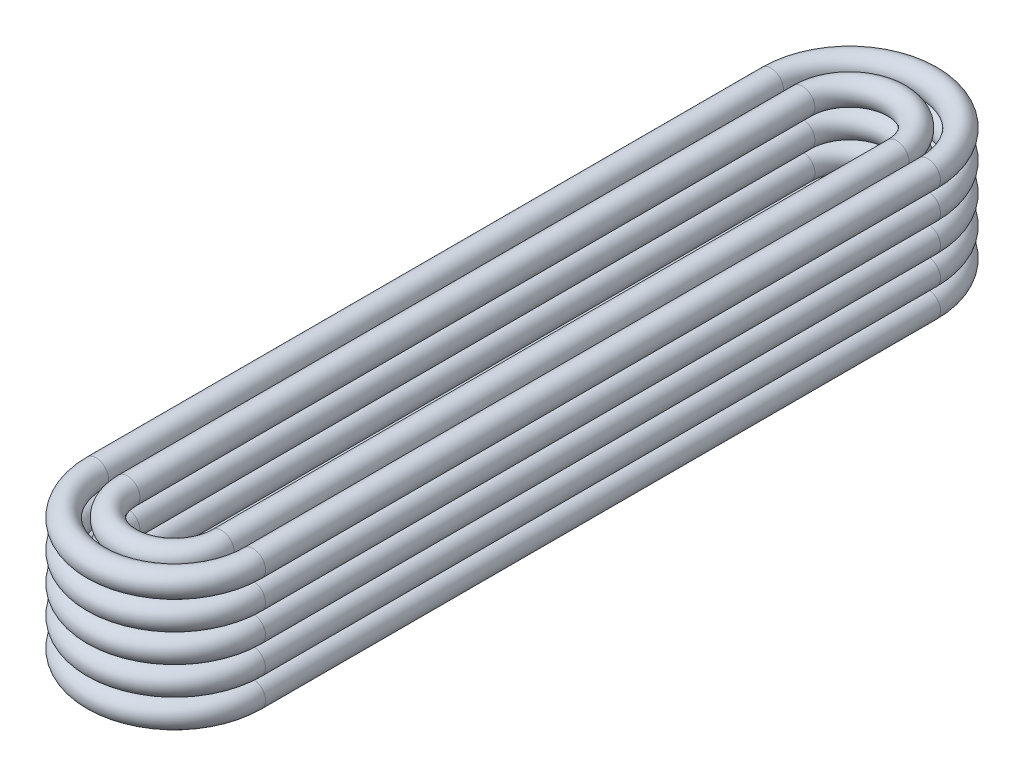
ISO-10303-21;
HEADER;
FILE_DESCRIPTION(('STEP AP214'),'2;1');
FILE_NAME('part.step','',(''),(''),'','','');
FILE_SCHEMA(('AUTOMOTIVE_DESIGN { 1 0 10303 214 1 1 1 1 }'));
ENDSEC;
DATA;
#1=APPLICATION_CONTEXT('core data for automotive mechanical design processes');
#2=APPLICATION_PROTOCOL_DEFINITION('international standard','automotive_design',2000,#1);
#3=PRODUCT_CONTEXT('',#1,'mechanical');
#4=PRODUCT('Part','Part','',(#3));
#5=PRODUCT_RELATED_PRODUCT_CATEGORY('part','',(#4));
#6=PRODUCT_DEFINITION_FORMATION('','',#4);
#7=PRODUCT_DEFINITION_CONTEXT('part definition',#1,'design');
#8=PRODUCT_DEFINITION('design','',#6,#7);
#9=PRODUCT_DEFINITION_SHAPE('','',#8);
#10=(LENGTH_UNIT() NAMED_UNIT(*) SI_UNIT(.MILLI.,.METRE.));
#11=(NAMED_UNIT(*) PLANE_ANGLE_UNIT() SI_UNIT($,.RADIAN.));
#12=(NAMED_UNIT(*) SI_UNIT($,.STERADIAN.) SOLID_ANGLE_UNIT());
#13=UNCERTAINTY_MEASURE_WITH_UNIT(LENGTH_MEASURE(1.E-05),#10,'distance_accuracy_value','');
#14=(GEOMETRIC_REPRESENTATION_CONTEXT(3) GLOBAL_UNCERTAINTY_ASSIGNED_CONTEXT((#13)) GLOBAL_UNIT_ASSIGNED_CONTEXT((#10,
#11,#12)) REPRESENTATION_CONTEXT('',''));
#15=CARTESIAN_POINT('',(0.,0.,0.));
#16=DIRECTION('',(0.,0.,1.));
#17=DIRECTION('',(1.,0.,0.));
#18=AXIS2_PLACEMENT_3D('',#15,#16,#17);
#19=CARTESIAN_POINT('',(0.,7.2,21.5));
#20=DIRECTION('',(0.,-1.,0.));
#21=DIRECTION('',(0.,0.,-1.));
#22=AXIS2_PLACEMENT_3D('',#19,#20,#21);
#23=TOROIDAL_SURFACE('',#22,5.,0.800000000000001);
#24=CARTESIAN_POINT('',(4.99999999999999,7.2,21.5));
#25=DIRECTION('',(0.,0.,-1.));
#26=DIRECTION('',(-1.,0.,0.));
#27=AXIS2_PLACEMENT_3D('',#24,#25,#26);
#28=CIRCLE('',#27,0.800000000000001);
#29=CARTESIAN_POINT('',(5.8,7.2,21.5));
#30=VERTEX_POINT('',#29);
#31=EDGE_CURVE('E46',#30,#30,#28,.T.);
#32=CARTESIAN_POINT('',(-5.,7.2,21.5));
#33=DIRECTION('',(0.,0.,1.));
#34=DIRECTION('',(1.,0.,0.));
#35=AXIS2_PLACEMENT_3D('',#32,#33,#34);
#36=CIRCLE('',#35,0.800000000000001);
#37=CARTESIAN_POINT('',(-5.8,7.2,21.5));
#38=VERTEX_POINT('',#37);
#39=EDGE_CURVE('E11',#38,#38,#36,.T.);
#40=CARTESIAN_POINT('',(0.,7.2,21.5));
#41=DIRECTION('',(0.,-1.,0.));
#42=DIRECTION('',(0.,0.,-1.));
#43=AXIS2_PLACEMENT_3D('',#40,#41,#42);
#44=CIRCLE('',#43,5.8);
#45=EDGE_CURVE('',#30,#38,#44,.T.);
#46=ORIENTED_EDGE('',*,*,#31,.F.);
#47=ORIENTED_EDGE('',*,*,#39,.T.);
#48=ORIENTED_EDGE('',*,*,#45,.T.);
#49=ORIENTED_EDGE('',*,*,#45,.F.);
#50=EDGE_LOOP('',(#46,#48,#47,#49));
#51=FACE_BOUND('',#50,.T.);
#52=ADVANCED_FACE('F40',(#51),#23,.T.);
#53=CARTESIAN_POINT('',(5.,7.2,-21.5));
#54=DIRECTION('',(0.,0.,1.));
#55=DIRECTION('',(1.,0.,0.));
#56=AXIS2_PLACEMENT_3D('',#53,#54,#55);
#57=CYLINDRICAL_SURFACE('',#56,0.800000000000001);
#58=CARTESIAN_POINT('',(5.,7.2,-21.5));
#59=DIRECTION('',(0.,0.,-1.));
#60=DIRECTION('',(-1.,0.,0.));
#61=AXIS2_PLACEMENT_3D('',#58,#59,#60);
#62=CIRCLE('',#61,0.800000000000001);
#63=CARTESIAN_POINT('',(5.8,7.2,-21.5));
#64=VERTEX_POINT('',#63);
#65=EDGE_CURVE('E50',#64,#64,#62,.T.);
#66=ORIENTED_EDGE('',*,*,#65,.F.);
#67=EDGE_LOOP('',(#66));
#68=FACE_BOUND('',#67,.T.);
#69=ORIENTED_EDGE('',*,*,#31,.T.);
#70=EDGE_LOOP('',(#69));
#71=FACE_BOUND('',#70,.T.);
#72=ADVANCED_FACE('F66',(#68,#71),#57,.T.);
#73=CARTESIAN_POINT('',(0.,7.2,-21.5));
#74=DIRECTION('',(0.,-1.,0.));
#75=DIRECTION('',(0.,0.,-1.));
#76=AXIS2_PLACEMENT_3D('',#73,#74,#75);
#77=TOROIDAL_SURFACE('',#76,5.,0.800000000000001);
#78=CARTESIAN_POINT('',(-5.00000000000001,7.2,-21.5));
#79=DIRECTION('',(0.,0.,1.));
#80=DIRECTION('',(1.,0.,0.));
#81=AXIS2_PLACEMENT_3D('',#78,#79,#80);
#82=CIRCLE('',#81,0.800000000000001);
#83=CARTESIAN_POINT('',(-5.80000000000001,7.2,-21.5));
#84=VERTEX_POINT('',#83);
#85=EDGE_CURVE('E54',#84,#84,#82,.T.);
#86=CARTESIAN_POINT('',(0.,7.2,-21.5));
#87=DIRECTION('',(0.,-1.,0.));
#88=DIRECTION('',(0.,0.,-1.));
#89=AXIS2_PLACEMENT_3D('',#86,#87,#88);
#90=CIRCLE('',#89,5.8);
#91=EDGE_CURVE('',#84,#64,#90,.T.);
#92=ORIENTED_EDGE('',*,*,#85,.F.);
#93=ORIENTED_EDGE('',*,*,#65,.T.);
#94=ORIENTED_EDGE('',*,*,#91,.T.);
#95=ORIENTED_EDGE('',*,*,#91,.F.);
#96=EDGE_LOOP('',(#92,#94,#93,#95));
#97=FACE_BOUND('',#96,.T.);
#98=ADVANCED_FACE('F63',(#97),#77,.T.);
#99=CARTESIAN_POINT('',(-5.00000000000001,7.2,-21.5));
#100=DIRECTION('',(0.,0.,1.));
#101=DIRECTION('',(1.,0.,0.));
#102=AXIS2_PLACEMENT_3D('',#99,#100,#101);
#103=CYLINDRICAL_SURFACE('',#102,0.800000000000001);
#104=ORIENTED_EDGE('',*,*,#85,.T.);
#105=EDGE_LOOP('',(#104));
#106=FACE_BOUND('',#105,.T.);
#107=ORIENTED_EDGE('',*,*,#39,.F.);
#108=EDGE_LOOP('',(#107));
#109=FACE_BOUND('',#108,.T.);
#110=ADVANCED_FACE('F60',(#106,#109),#103,.T.);
#111=CLOSED_SHELL('',(#52,#72,#98,#110));
#112=MANIFOLD_SOLID_BREP('B2',#111);
#113=CARTESIAN_POINT('',(0.,5.4,21.5));
#114=DIRECTION('',(0.,-1.,0.));
#115=DIRECTION('',(0.,0.,-1.));
#116=AXIS2_PLACEMENT_3D('',#113,#114,#115);
#117=TOROIDAL_SURFACE('',#116,5.,0.800000000000001);
#118=CARTESIAN_POINT('',(5.,5.4,21.5));
#119=DIRECTION('',(0.,0.,-1.));
#120=DIRECTION('',(-1.,0.,0.));
#121=AXIS2_PLACEMENT_3D('',#118,#119,#120);
#122=CIRCLE('',#121,0.800000000000001);
#123=CARTESIAN_POINT('',(5.8,5.4,21.5));
#124=VERTEX_POINT('',#123);
#125=EDGE_CURVE('E119',#124,#124,#122,.T.);
#126=CARTESIAN_POINT('',(-5.,5.4,21.5));
#127=DIRECTION('',(0.,0.,1.));
#128=DIRECTION('',(1.,0.,0.));
#129=AXIS2_PLACEMENT_3D('',#126,#127,#128);
#130=CIRCLE('',#129,0.800000000000001);
#131=CARTESIAN_POINT('',(-5.8,5.4,21.5));
#132=VERTEX_POINT('',#131);
#133=EDGE_CURVE('E39',#132,#132,#130,.T.);
#134=CARTESIAN_POINT('',(0.,5.4,21.5));
#135=DIRECTION('',(0.,-1.,0.));
#136=DIRECTION('',(0.,0.,-1.));
#137=AXIS2_PLACEMENT_3D('',#134,#135,#136);
#138=CIRCLE('',#137,5.8);
#139=EDGE_CURVE('',#124,#132,#138,.T.);
#140=ORIENTED_EDGE('',*,*,#125,.F.);
#141=ORIENTED_EDGE('',*,*,#133,.T.);
#142=ORIENTED_EDGE('',*,*,#139,.T.);
#143=ORIENTED_EDGE('',*,*,#139,.F.);
#144=EDGE_LOOP('',(#140,#142,#141,#143));
#145=FACE_BOUND('',#144,.T.);
#146=ADVANCED_FACE('F113',(#145),#117,.T.);
#147=CARTESIAN_POINT('',(5.,5.4,-21.5));
#148=DIRECTION('',(0.,0.,1.));
#149=DIRECTION('',(1.,0.,0.));
#150=AXIS2_PLACEMENT_3D('',#147,#148,#149);
#151=CYLINDRICAL_SURFACE('',#150,0.800000000000001);
#152=CARTESIAN_POINT('',(5.,5.4,-21.5));
#153=DIRECTION('',(0.,0.,-1.));
#154=DIRECTION('',(-1.,0.,0.));
#155=AXIS2_PLACEMENT_3D('',#152,#153,#154);
#156=CIRCLE('',#155,0.800000000000001);
#157=CARTESIAN_POINT('',(5.8,5.4,-21.5));
#158=VERTEX_POINT('',#157);
#159=EDGE_CURVE('E123',#158,#158,#156,.T.);
#160=ORIENTED_EDGE('',*,*,#159,.F.);
#161=EDGE_LOOP('',(#160));
#162=FACE_BOUND('',#161,.T.);
#163=ORIENTED_EDGE('',*,*,#125,.T.);
#164=EDGE_LOOP('',(#163));
#165=FACE_BOUND('',#164,.T.);
#166=ADVANCED_FACE('F139',(#162,#165),#151,.T.);
#167=CARTESIAN_POINT('',(0.,5.4,-21.5));
#168=DIRECTION('',(0.,-1.,0.));
#169=DIRECTION('',(0.,0.,-1.));
#170=AXIS2_PLACEMENT_3D('',#167,#168,#169);
#171=TOROIDAL_SURFACE('',#170,5.,0.800000000000001);
#172=CARTESIAN_POINT('',(-5.,5.4,-21.5));
#173=DIRECTION('',(0.,0.,1.));
#174=DIRECTION('',(1.,0.,0.));
#175=AXIS2_PLACEMENT_3D('',#172,#173,#174);
#176=CIRCLE('',#175,0.800000000000001);
#177=CARTESIAN_POINT('',(-5.80000000000001,5.4,-21.5));
#178=VERTEX_POINT('',#177);
#179=EDGE_CURVE('E127',#178,#178,#176,.T.);
#180=CARTESIAN_POINT('',(0.,5.4,-21.5));
#181=DIRECTION('',(0.,-1.,0.));
#182=DIRECTION('',(0.,0.,-1.));
#183=AXIS2_PLACEMENT_3D('',#180,#181,#182);
#184=CIRCLE('',#183,5.8);
#185=EDGE_CURVE('',#178,#158,#184,.T.);
#186=ORIENTED_EDGE('',*,*,#179,.F.);
#187=ORIENTED_EDGE('',*,*,#159,.T.);
#188=ORIENTED_EDGE('',*,*,#185,.T.);
#189=ORIENTED_EDGE('',*,*,#185,.F.);
#190=EDGE_LOOP('',(#186,#188,#187,#189));
#191=FACE_BOUND('',#190,.T.);
#192=ADVANCED_FACE('F136',(#191),#171,.T.);
#193=CARTESIAN_POINT('',(-5.,5.4,-21.5));
#194=DIRECTION('',(0.,0.,1.));
#195=DIRECTION('',(1.,0.,0.));
#196=AXIS2_PLACEMENT_3D('',#193,#194,#195);
#197=CYLINDRICAL_SURFACE('',#196,0.800000000000001);
#198=ORIENTED_EDGE('',*,*,#179,.T.);
#199=EDGE_LOOP('',(#198));
#200=FACE_BOUND('',#199,.T.);
#201=ORIENTED_EDGE('',*,*,#133,.F.);
#202=EDGE_LOOP('',(#201));
#203=FACE_BOUND('',#202,.T.);
#204=ADVANCED_FACE('F133',(#200,#203),#197,.T.);
#205=CLOSED_SHELL('',(#146,#166,#192,#204));
#206=MANIFOLD_SOLID_BREP('B6',#205);
#207=CARTESIAN_POINT('',(0.,3.6,21.5));
#208=DIRECTION('',(0.,-1.,0.));
#209=DIRECTION('',(0.,0.,-1.));
#210=AXIS2_PLACEMENT_3D('',#207,#208,#209);
#211=TOROIDAL_SURFACE('',#210,5.,0.800000000000001);
#212=CARTESIAN_POINT('',(5.,3.6,21.5));
#213=DIRECTION('',(0.,0.,-1.));
#214=DIRECTION('',(-1.,0.,0.));
#215=AXIS2_PLACEMENT_3D('',#212,#213,#214);
#216=CIRCLE('',#215,0.800000000000001);
#217=CARTESIAN_POINT('',(5.8,3.6,21.5));
#218=VERTEX_POINT('',#217);
#219=EDGE_CURVE('E192',#218,#218,#216,.T.);
#220=CARTESIAN_POINT('',(-5.,3.6,21.5));
#221=DIRECTION('',(0.,0.,1.));
#222=DIRECTION('',(1.,0.,0.));
#223=AXIS2_PLACEMENT_3D('',#220,#221,#222);
#224=CIRCLE('',#223,0.800000000000001);
#225=CARTESIAN_POINT('',(-5.8,3.6,21.5));
#226=VERTEX_POINT('',#225);
#227=EDGE_CURVE('E112',#226,#226,#224,.T.);
#228=CARTESIAN_POINT('',(0.,3.6,21.5));
#229=DIRECTION('',(0.,-1.,0.));
#230=DIRECTION('',(0.,0.,-1.));
#231=AXIS2_PLACEMENT_3D('',#228,#229,#230);
#232=CIRCLE('',#231,5.8);
#233=EDGE_CURVE('',#218,#226,#232,.T.);
#234=ORIENTED_EDGE('',*,*,#219,.F.);
#235=ORIENTED_EDGE('',*,*,#227,.T.);
#236=ORIENTED_EDGE('',*,*,#233,.T.);
#237=ORIENTED_EDGE('',*,*,#233,.F.);
#238=EDGE_LOOP('',(#234,#236,#235,#237));
#239=FACE_BOUND('',#238,.T.);
#240=ADVANCED_FACE('F186',(#239),#211,.T.);
#241=CARTESIAN_POINT('',(5.,3.6,-21.5));
#242=DIRECTION('',(0.,0.,1.));
#243=DIRECTION('',(1.,0.,0.));
#244=AXIS2_PLACEMENT_3D('',#241,#242,#243);
#245=CYLINDRICAL_SURFACE('',#244,0.800000000000001);
#246=CARTESIAN_POINT('',(5.,3.6,-21.5));
#247=DIRECTION('',(0.,0.,-1.));
#248=DIRECTION('',(-1.,0.,0.));
#249=AXIS2_PLACEMENT_3D('',#246,#247,#248);
#250=CIRCLE('',#249,0.800000000000001);
#251=CARTESIAN_POINT('',(5.80000000000001,3.6,-21.5));
#252=VERTEX_POINT('',#251);
#253=EDGE_CURVE('E196',#252,#252,#250,.T.);
#254=ORIENTED_EDGE('',*,*,#253,.F.);
#255=EDGE_LOOP('',(#254));
#256=FACE_BOUND('',#255,.T.);
#257=ORIENTED_EDGE('',*,*,#219,.T.);
#258=EDGE_LOOP('',(#257));
#259=FACE_BOUND('',#258,.T.);
#260=ADVANCED_FACE('F212',(#256,#259),#245,.T.);
#261=CARTESIAN_POINT('',(0.,3.6,-21.5));
#262=DIRECTION('',(0.,-1.,0.));
#263=DIRECTION('',(0.,0.,-1.));
#264=AXIS2_PLACEMENT_3D('',#261,#262,#263);
#265=TOROIDAL_SURFACE('',#264,5.,0.800000000000001);
#266=CARTESIAN_POINT('',(-5.,3.6,-21.5));
#267=DIRECTION('',(0.,0.,1.));
#268=DIRECTION('',(1.,0.,0.));
#269=AXIS2_PLACEMENT_3D('',#266,#267,#268);
#270=CIRCLE('',#269,0.800000000000001);
#271=CARTESIAN_POINT('',(-5.8,3.6,-21.5));
#272=VERTEX_POINT('',#271);
#273=EDGE_CURVE('E200',#272,#272,#270,.T.);
#274=CARTESIAN_POINT('',(0.,3.6,-21.5));
#275=DIRECTION('',(0.,-1.,0.));
#276=DIRECTION('',(0.,0.,-1.));
#277=AXIS2_PLACEMENT_3D('',#274,#275,#276);
#278=CIRCLE('',#277,5.8);
#279=EDGE_CURVE('',#272,#252,#278,.T.);
#280=ORIENTED_EDGE('',*,*,#273,.F.);
#281=ORIENTED_EDGE('',*,*,#253,.T.);
#282=ORIENTED_EDGE('',*,*,#279,.T.);
#283=ORIENTED_EDGE('',*,*,#279,.F.);
#284=EDGE_LOOP('',(#280,#282,#281,#283));
#285=FACE_BOUND('',#284,.T.);
#286=ADVANCED_FACE('F209',(#285),#265,.T.);
#287=CARTESIAN_POINT('',(-5.,3.6,-21.5));
#288=DIRECTION('',(0.,0.,1.));
#289=DIRECTION('',(1.,0.,0.));
#290=AXIS2_PLACEMENT_3D('',#287,#288,#289);
#291=CYLINDRICAL_SURFACE('',#290,0.800000000000001);
#292=ORIENTED_EDGE('',*,*,#273,.T.);
#293=EDGE_LOOP('',(#292));
#294=FACE_BOUND('',#293,.T.);
#295=ORIENTED_EDGE('',*,*,#227,.F.);
#296=EDGE_LOOP('',(#295));
#297=FACE_BOUND('',#296,.T.);
#298=ADVANCED_FACE('F206',(#294,#297),#291,.T.);
#299=CLOSED_SHELL('',(#240,#260,#286,#298));
#300=MANIFOLD_SOLID_BREP('B34',#299);
#301=CARTESIAN_POINT('',(0.,1.8,21.5));
#302=DIRECTION('',(0.,-1.,0.));
#303=DIRECTION('',(0.,0.,-1.));
#304=AXIS2_PLACEMENT_3D('',#301,#302,#303);
#305=TOROIDAL_SURFACE('',#304,5.,0.800000000000001);
#306=CARTESIAN_POINT('',(5.,1.8,21.5));
#307=DIRECTION('',(0.,0.,-1.));
#308=DIRECTION('',(-1.,0.,0.));
#309=AXIS2_PLACEMENT_3D('',#306,#307,#308);
#310=CIRCLE('',#309,0.800000000000001);
#311=CARTESIAN_POINT('',(5.8,1.8,21.5));
#312=VERTEX_POINT('',#311);
#313=EDGE_CURVE('E265',#312,#312,#310,.T.);
#314=CARTESIAN_POINT('',(-4.99999999999999,1.8,21.5));
#315=DIRECTION('',(0.,0.,1.));
#316=DIRECTION('',(1.,0.,0.));
#317=AXIS2_PLACEMENT_3D('',#314,#315,#316);
#318=CIRCLE('',#317,0.800000000000001);
#319=CARTESIAN_POINT('',(-5.8,1.8,21.5));
#320=VERTEX_POINT('',#319);
#321=EDGE_CURVE('E185',#320,#320,#318,.T.);
#322=CARTESIAN_POINT('',(0.,1.8,21.5));
#323=DIRECTION('',(0.,-1.,0.));
#324=DIRECTION('',(0.,0.,-1.));
#325=AXIS2_PLACEMENT_3D('',#322,#323,#324);
#326=CIRCLE('',#325,5.8);
#327=EDGE_CURVE('',#312,#320,#326,.T.);
#328=ORIENTED_EDGE('',*,*,#313,.F.);
#329=ORIENTED_EDGE('',*,*,#321,.T.);
#330=ORIENTED_EDGE('',*,*,#327,.T.);
#331=ORIENTED_EDGE('',*,*,#327,.F.);
#332=EDGE_LOOP('',(#328,#330,#329,#331));
#333=FACE_BOUND('',#332,.T.);
#334=ADVANCED_FACE('F259',(#333),#305,.T.);
#335=CARTESIAN_POINT('',(5.00000000000001,1.8,-21.5));
#336=DIRECTION('',(0.,0.,1.));
#337=DIRECTION('',(1.,0.,0.));
#338=AXIS2_PLACEMENT_3D('',#335,#336,#337);
#339=CYLINDRICAL_SURFACE('',#338,0.800000000000001);
#340=CARTESIAN_POINT('',(5.00000000000001,1.8,-21.5));
#341=DIRECTION('',(0.,0.,-1.));
#342=DIRECTION('',(-1.,0.,0.));
#343=AXIS2_PLACEMENT_3D('',#340,#341,#342);
#344=CIRCLE('',#343,0.800000000000001);
#345=CARTESIAN_POINT('',(5.80000000000001,1.8,-21.5));
#346=VERTEX_POINT('',#345);
#347=EDGE_CURVE('E269',#346,#346,#344,.T.);
#348=ORIENTED_EDGE('',*,*,#347,.F.);
#349=EDGE_LOOP('',(#348));
#350=FACE_BOUND('',#349,.T.);
#351=ORIENTED_EDGE('',*,*,#313,.T.);
#352=EDGE_LOOP('',(#351));
#353=FACE_BOUND('',#352,.T.);
#354=ADVANCED_FACE('F285',(#350,#353),#339,.T.);
#355=CARTESIAN_POINT('',(0.,1.8,-21.5));
#356=DIRECTION('',(0.,-1.,0.));
#357=DIRECTION('',(0.,0.,-1.));
#358=AXIS2_PLACEMENT_3D('',#355,#356,#357);
#359=TOROIDAL_SURFACE('',#358,5.,0.800000000000001);
#360=CARTESIAN_POINT('',(-5.,1.8,-21.5));
#361=DIRECTION('',(0.,0.,1.));
#362=DIRECTION('',(1.,0.,0.));
#363=AXIS2_PLACEMENT_3D('',#360,#361,#362);
#364=CIRCLE('',#363,0.800000000000001);
#365=CARTESIAN_POINT('',(-5.8,1.8,-21.5));
#366=VERTEX_POINT('',#365);
#367=EDGE_CURVE('E273',#366,#366,#364,.T.);
#368=CARTESIAN_POINT('',(0.,1.8,-21.5));
#369=DIRECTION('',(0.,-1.,0.));
#370=DIRECTION('',(0.,0.,-1.));
#371=AXIS2_PLACEMENT_3D('',#368,#369,#370);
#372=CIRCLE('',#371,5.8);
#373=EDGE_CURVE('',#366,#346,#372,.T.);
#374=ORIENTED_EDGE('',*,*,#367,.F.);
#375=ORIENTED_EDGE('',*,*,#347,.T.);
#376=ORIENTED_EDGE('',*,*,#373,.T.);
#377=ORIENTED_EDGE('',*,*,#373,.F.);
#378=EDGE_LOOP('',(#374,#376,#375,#377));
#379=FACE_BOUND('',#378,.T.);
#380=ADVANCED_FACE('F282',(#379),#359,.T.);
#381=CARTESIAN_POINT('',(-5.,1.8,-21.5));
#382=DIRECTION('',(0.,0.,1.));
#383=DIRECTION('',(1.,0.,0.));
#384=AXIS2_PLACEMENT_3D('',#381,#382,#383);
#385=CYLINDRICAL_SURFACE('',#384,0.800000000000001);
#386=ORIENTED_EDGE('',*,*,#367,.T.);
#387=EDGE_LOOP('',(#386));
#388=FACE_BOUND('',#387,.T.);
#389=ORIENTED_EDGE('',*,*,#321,.F.);
#390=EDGE_LOOP('',(#389));
#391=FACE_BOUND('',#390,.T.);
#392=ADVANCED_FACE('F279',(#388,#391),#385,.T.);
#393=CLOSED_SHELL('',(#334,#354,#380,#392));
#394=MANIFOLD_SOLID_BREP('B107',#393);
#395=CARTESIAN_POINT('',(0.,7.2,-21.5));
#396=DIRECTION('',(0.,1.,0.));
#397=DIRECTION('',(0.,0.,1.));
#398=AXIS2_PLACEMENT_3D('',#395,#396,#397);
#399=TOROIDAL_SURFACE('',#398,3.00000000000001,0.8);
#400=CARTESIAN_POINT('',(3.00000000000001,7.2,-21.5));
#401=DIRECTION('',(0.,0.,-1.));
#402=DIRECTION('',(-1.,0.,0.));
#403=AXIS2_PLACEMENT_3D('',#400,#401,#402);
#404=CIRCLE('',#403,0.8);
#405=CARTESIAN_POINT('',(3.80000000000001,7.2,-21.5));
#406=VERTEX_POINT('',#405);
#407=EDGE_CURVE('E338',#406,#406,#404,.T.);
#408=CARTESIAN_POINT('',(-3.00000000000002,7.2,-21.5));
#409=DIRECTION('',(0.,0.,1.));
#410=DIRECTION('',(1.,0.,0.));
#411=AXIS2_PLACEMENT_3D('',#408,#409,#410);
#412=CIRCLE('',#411,0.8);
#413=CARTESIAN_POINT('',(-3.80000000000001,7.2,-21.5));
#414=VERTEX_POINT('',#413);
#415=EDGE_CURVE('E258',#414,#414,#412,.T.);
#416=CARTESIAN_POINT('',(0.,7.2,-21.5));
#417=DIRECTION('',(0.,1.,0.));
#418=DIRECTION('',(0.,0.,1.));
#419=AXIS2_PLACEMENT_3D('',#416,#417,#418);
#420=CIRCLE('',#419,3.80000000000001);
#421=EDGE_CURVE('',#406,#414,#420,.T.);
#422=ORIENTED_EDGE('',*,*,#407,.T.);
#423=ORIENTED_EDGE('',*,*,#415,.F.);
#424=ORIENTED_EDGE('',*,*,#421,.T.);
#425=ORIENTED_EDGE('',*,*,#421,.F.);
#426=EDGE_LOOP('',(#422,#424,#423,#425));
#427=FACE_BOUND('',#426,.T.);
#428=ADVANCED_FACE('F332',(#427),#399,.T.);
#429=CARTESIAN_POINT('',(3.,7.2,21.5));
#430=DIRECTION('',(0.,0.,-1.));
#431=DIRECTION('',(-1.,0.,0.));
#432=AXIS2_PLACEMENT_3D('',#429,#430,#431);
#433=CYLINDRICAL_SURFACE('',#432,0.8);
#434=CARTESIAN_POINT('',(3.,7.2,21.5));
#435=DIRECTION('',(0.,0.,-1.));
#436=DIRECTION('',(-1.,0.,0.));
#437=AXIS2_PLACEMENT_3D('',#434,#435,#436);
#438=CIRCLE('',#437,0.8);
#439=CARTESIAN_POINT('',(3.8,7.2,21.5));
#440=VERTEX_POINT('',#439);
#441=EDGE_CURVE('E342',#440,#440,#438,.T.);
#442=ORIENTED_EDGE('',*,*,#441,.T.);
#443=EDGE_LOOP('',(#442));
#444=FACE_BOUND('',#443,.T.);
#445=ORIENTED_EDGE('',*,*,#407,.F.);
#446=EDGE_LOOP('',(#445));
#447=FACE_BOUND('',#446,.T.);
#448=ADVANCED_FACE('F361',(#444,#447),#433,.T.);
#449=CARTESIAN_POINT('',(0.,7.2,21.5));
#450=DIRECTION('',(0.,1.,0.));
#451=DIRECTION('',(0.,0.,1.));
#452=AXIS2_PLACEMENT_3D('',#449,#450,#451);
#453=TOROIDAL_SURFACE('',#452,3.00000000000001,0.8);
#454=CARTESIAN_POINT('',(-3.00000000000001,7.2,21.5));
#455=DIRECTION('',(0.,0.,1.));
#456=DIRECTION('',(1.,0.,0.));
#457=AXIS2_PLACEMENT_3D('',#454,#455,#456);
#458=CIRCLE('',#457,0.8);
#459=CARTESIAN_POINT('',(-3.80000000000001,7.2,21.5));
#460=VERTEX_POINT('',#459);
#461=EDGE_CURVE('E346',#460,#460,#458,.T.);
#462=CARTESIAN_POINT('',(0.,7.2,21.5));
#463=DIRECTION('',(0.,1.,0.));
#464=DIRECTION('',(0.,0.,1.));
#465=AXIS2_PLACEMENT_3D('',#462,#463,#464);
#466=CIRCLE('',#465,3.80000000000001);
#467=EDGE_CURVE('',#460,#440,#466,.T.);
#468=ORIENTED_EDGE('',*,*,#461,.T.);
#469=ORIENTED_EDGE('',*,*,#441,.F.);
#470=ORIENTED_EDGE('',*,*,#467,.T.);
#471=ORIENTED_EDGE('',*,*,#467,.F.);
#472=EDGE_LOOP('',(#468,#470,#469,#471));
#473=FACE_BOUND('',#472,.T.);
#474=ADVANCED_FACE('F352',(#473),#453,.T.);
#475=CARTESIAN_POINT('',(-3.00000000000001,7.2,21.5));
#476=DIRECTION('',(0.,0.,-1.));
#477=DIRECTION('',(-1.,0.,0.));
#478=AXIS2_PLACEMENT_3D('',#475,#476,#477);
#479=CYLINDRICAL_SURFACE('',#478,0.8);
#480=ORIENTED_EDGE('',*,*,#461,.F.);
#481=EDGE_LOOP('',(#480));
#482=FACE_BOUND('',#481,.T.);
#483=ORIENTED_EDGE('',*,*,#415,.T.);
#484=EDGE_LOOP('',(#483));
#485=FACE_BOUND('',#484,.T.);
#486=ADVANCED_FACE('F355',(#482,#485),#479,.T.);
#487=CLOSED_SHELL('',(#428,#448,#474,#486));
#488=MANIFOLD_SOLID_BREP('B180',#487);
#489=CARTESIAN_POINT('',(0.,5.4,-21.5));
#490=DIRECTION('',(0.,1.,0.));
#491=DIRECTION('',(0.,0.,1.));
#492=AXIS2_PLACEMENT_3D('',#489,#490,#491);
#493=TOROIDAL_SURFACE('',#492,3.00000000000001,0.8);
#494=CARTESIAN_POINT('',(3.00000000000001,5.4,-21.5));
#495=DIRECTION('',(0.,0.,-1.));
#496=DIRECTION('',(-1.,0.,0.));
#497=AXIS2_PLACEMENT_3D('',#494,#495,#496);
#498=CIRCLE('',#497,0.8);
#499=CARTESIAN_POINT('',(3.80000000000001,5.4,-21.5));
#500=VERTEX_POINT('',#499);
#501=EDGE_CURVE('E411',#500,#500,#498,.T.);
#502=CARTESIAN_POINT('',(-3.00000000000001,5.4,-21.5));
#503=DIRECTION('',(0.,0.,1.));
#504=DIRECTION('',(1.,0.,0.));
#505=AXIS2_PLACEMENT_3D('',#502,#503,#504);
#506=CIRCLE('',#505,0.8);
#507=CARTESIAN_POINT('',(-3.80000000000001,5.4,-21.5));
#508=VERTEX_POINT('',#507);
#509=EDGE_CURVE('E331',#508,#508,#506,.T.);
#510=CARTESIAN_POINT('',(0.,5.4,-21.5));
#511=DIRECTION('',(0.,1.,0.));
#512=DIRECTION('',(0.,0.,1.));
#513=AXIS2_PLACEMENT_3D('',#510,#511,#512);
#514=CIRCLE('',#513,3.80000000000001);
#515=EDGE_CURVE('',#500,#508,#514,.T.);
#516=ORIENTED_EDGE('',*,*,#501,.T.);
#517=ORIENTED_EDGE('',*,*,#509,.F.);
#518=ORIENTED_EDGE('',*,*,#515,.T.);
#519=ORIENTED_EDGE('',*,*,#515,.F.);
#520=EDGE_LOOP('',(#516,#518,#517,#519));
#521=FACE_BOUND('',#520,.T.);
#522=ADVANCED_FACE('F405',(#521),#493,.T.);
#523=CARTESIAN_POINT('',(3.00000000000001,5.4,21.5));
#524=DIRECTION('',(0.,0.,-1.));
#525=DIRECTION('',(-1.,0.,0.));
#526=AXIS2_PLACEMENT_3D('',#523,#524,#525);
#527=CYLINDRICAL_SURFACE('',#526,0.8);
#528=CARTESIAN_POINT('',(3.00000000000001,5.4,21.5));
#529=DIRECTION('',(0.,0.,-1.));
#530=DIRECTION('',(-1.,0.,0.));
#531=AXIS2_PLACEMENT_3D('',#528,#529,#530);
#532=CIRCLE('',#531,0.8);
#533=CARTESIAN_POINT('',(3.80000000000001,5.4,21.5));
#534=VERTEX_POINT('',#533);
#535=EDGE_CURVE('E415',#534,#534,#532,.T.);
#536=ORIENTED_EDGE('',*,*,#535,.T.);
#537=EDGE_LOOP('',(#536));
#538=FACE_BOUND('',#537,.T.);
#539=ORIENTED_EDGE('',*,*,#501,.F.);
#540=EDGE_LOOP('',(#539));
#541=FACE_BOUND('',#540,.T.);
#542=ADVANCED_FACE('F434',(#538,#541),#527,.T.);
#543=CARTESIAN_POINT('',(0.,5.4,21.5));
#544=DIRECTION('',(0.,1.,0.));
#545=DIRECTION('',(0.,0.,1.));
#546=AXIS2_PLACEMENT_3D('',#543,#544,#545);
#547=TOROIDAL_SURFACE('',#546,3.00000000000001,0.8);
#548=CARTESIAN_POINT('',(-3.00000000000001,5.4,21.5));
#549=DIRECTION('',(0.,0.,1.));
#550=DIRECTION('',(1.,0.,0.));
#551=AXIS2_PLACEMENT_3D('',#548,#549,#550);
#552=CIRCLE('',#551,0.8);
#553=CARTESIAN_POINT('',(-3.80000000000001,5.4,21.5));
#554=VERTEX_POINT('',#553);
#555=EDGE_CURVE('E419',#554,#554,#552,.T.);
#556=CARTESIAN_POINT('',(0.,5.4,21.5));
#557=DIRECTION('',(0.,1.,0.));
#558=DIRECTION('',(0.,0.,1.));
#559=AXIS2_PLACEMENT_3D('',#556,#557,#558);
#560=CIRCLE('',#559,3.80000000000001);
#561=EDGE_CURVE('',#554,#534,#560,.T.);
#562=ORIENTED_EDGE('',*,*,#555,.T.);
#563=ORIENTED_EDGE('',*,*,#535,.F.);
#564=ORIENTED_EDGE('',*,*,#561,.T.);
#565=ORIENTED_EDGE('',*,*,#561,.F.);
#566=EDGE_LOOP('',(#562,#564,#563,#565));
#567=FACE_BOUND('',#566,.T.);
#568=ADVANCED_FACE('F425',(#567),#547,.T.);
#569=CARTESIAN_POINT('',(-3.00000000000001,5.4,21.5));
#570=DIRECTION('',(0.,0.,-1.));
#571=DIRECTION('',(-1.,0.,0.));
#572=AXIS2_PLACEMENT_3D('',#569,#570,#571);
#573=CYLINDRICAL_SURFACE('',#572,0.8);
#574=ORIENTED_EDGE('',*,*,#555,.F.);
#575=EDGE_LOOP('',(#574));
#576=FACE_BOUND('',#575,.T.);
#577=ORIENTED_EDGE('',*,*,#509,.T.);
#578=EDGE_LOOP('',(#577));
#579=FACE_BOUND('',#578,.T.);
#580=ADVANCED_FACE('F428',(#576,#579),#573,.T.);
#581=CLOSED_SHELL('',(#522,#542,#568,#580));
#582=MANIFOLD_SOLID_BREP('B253',#581);
#583=CARTESIAN_POINT('',(0.,3.6,-21.5));
#584=DIRECTION('',(0.,1.,0.));
#585=DIRECTION('',(0.,0.,1.));
#586=AXIS2_PLACEMENT_3D('',#583,#584,#585);
#587=TOROIDAL_SURFACE('',#586,3.00000000000001,0.8);
#588=CARTESIAN_POINT('',(3.00000000000001,3.6,-21.5));
#589=DIRECTION('',(0.,0.,-1.));
#590=DIRECTION('',(-1.,0.,0.));
#591=AXIS2_PLACEMENT_3D('',#588,#589,#590);
#592=CIRCLE('',#591,0.8);
#593=CARTESIAN_POINT('',(3.80000000000001,3.6,-21.5));
#594=VERTEX_POINT('',#593);
#595=EDGE_CURVE('E484',#594,#594,#592,.T.);
#596=CARTESIAN_POINT('',(-3.00000000000001,3.6,-21.5));
#597=DIRECTION('',(0.,0.,1.));
#598=DIRECTION('',(1.,0.,0.));
#599=AXIS2_PLACEMENT_3D('',#596,#597,#598);
#600=CIRCLE('',#599,0.8);
#601=CARTESIAN_POINT('',(-3.80000000000001,3.6,-21.5));
#602=VERTEX_POINT('',#601);
#603=EDGE_CURVE('E404',#602,#602,#600,.T.);
#604=CARTESIAN_POINT('',(0.,3.6,-21.5));
#605=DIRECTION('',(0.,1.,0.));
#606=DIRECTION('',(0.,0.,1.));
#607=AXIS2_PLACEMENT_3D('',#604,#605,#606);
#608=CIRCLE('',#607,3.80000000000001);
#609=EDGE_CURVE('',#594,#602,#608,.T.);
#610=ORIENTED_EDGE('',*,*,#595,.T.);
#611=ORIENTED_EDGE('',*,*,#603,.F.);
#612=ORIENTED_EDGE('',*,*,#609,.T.);
#613=ORIENTED_EDGE('',*,*,#609,.F.);
#614=EDGE_LOOP('',(#610,#612,#611,#613));
#615=FACE_BOUND('',#614,.T.);
#616=ADVANCED_FACE('F478',(#615),#587,.T.);
#617=CARTESIAN_POINT('',(3.00000000000001,3.6,21.5));
#618=DIRECTION('',(0.,0.,-1.));
#619=DIRECTION('',(-1.,0.,0.));
#620=AXIS2_PLACEMENT_3D('',#617,#618,#619);
#621=CYLINDRICAL_SURFACE('',#620,0.8);
#622=CARTESIAN_POINT('',(3.00000000000001,3.6,21.5));
#623=DIRECTION('',(0.,0.,-1.));
#624=DIRECTION('',(-1.,0.,0.));
#625=AXIS2_PLACEMENT_3D('',#622,#623,#624);
#626=CIRCLE('',#625,0.8);
#627=CARTESIAN_POINT('',(3.80000000000001,3.6,21.5));
#628=VERTEX_POINT('',#627);
#629=EDGE_CURVE('E488',#628,#628,#626,.T.);
#630=ORIENTED_EDGE('',*,*,#629,.T.);
#631=EDGE_LOOP('',(#630));
#632=FACE_BOUND('',#631,.T.);
#633=ORIENTED_EDGE('',*,*,#595,.F.);
#634=EDGE_LOOP('',(#633));
#635=FACE_BOUND('',#634,.T.);
#636=ADVANCED_FACE('F507',(#632,#635),#621,.T.);
#637=CARTESIAN_POINT('',(0.,3.6,21.5));
#638=DIRECTION('',(0.,1.,0.));
#639=DIRECTION('',(0.,0.,1.));
#640=AXIS2_PLACEMENT_3D('',#637,#638,#639);
#641=TOROIDAL_SURFACE('',#640,3.00000000000001,0.8);
#642=CARTESIAN_POINT('',(-3.00000000000001,3.6,21.5));
#643=DIRECTION('',(0.,0.,1.));
#644=DIRECTION('',(1.,0.,0.));
#645=AXIS2_PLACEMENT_3D('',#642,#643,#644);
#646=CIRCLE('',#645,0.8);
#647=CARTESIAN_POINT('',(-3.8,3.6,21.5));
#648=VERTEX_POINT('',#647);
#649=EDGE_CURVE('E492',#648,#648,#646,.T.);
#650=CARTESIAN_POINT('',(0.,3.6,21.5));
#651=DIRECTION('',(0.,1.,0.));
#652=DIRECTION('',(0.,0.,1.));
#653=AXIS2_PLACEMENT_3D('',#650,#651,#652);
#654=CIRCLE('',#653,3.80000000000001);
#655=EDGE_CURVE('',#648,#628,#654,.T.);
#656=ORIENTED_EDGE('',*,*,#649,.T.);
#657=ORIENTED_EDGE('',*,*,#629,.F.);
#658=ORIENTED_EDGE('',*,*,#655,.T.);
#659=ORIENTED_EDGE('',*,*,#655,.F.);
#660=EDGE_LOOP('',(#656,#658,#657,#659));
#661=FACE_BOUND('',#660,.T.);
#662=ADVANCED_FACE('F498',(#661),#641,.T.);
#663=CARTESIAN_POINT('',(-3.00000000000001,3.6,21.5));
#664=DIRECTION('',(0.,0.,-1.));
#665=DIRECTION('',(-1.,0.,0.));
#666=AXIS2_PLACEMENT_3D('',#663,#664,#665);
#667=CYLINDRICAL_SURFACE('',#666,0.8);
#668=ORIENTED_EDGE('',*,*,#649,.F.);
#669=EDGE_LOOP('',(#668));
#670=FACE_BOUND('',#669,.T.);
#671=ORIENTED_EDGE('',*,*,#603,.T.);
#672=EDGE_LOOP('',(#671));
#673=FACE_BOUND('',#672,.T.);
#674=ADVANCED_FACE('F501',(#670,#673),#667,.T.);
#675=CLOSED_SHELL('',(#616,#636,#662,#674));
#676=MANIFOLD_SOLID_BREP('B326',#675);
#677=CARTESIAN_POINT('',(0.,1.8,-21.5));
#678=DIRECTION('',(0.,1.,0.));
#679=DIRECTION('',(0.,0.,1.));
#680=AXIS2_PLACEMENT_3D('',#677,#678,#679);
#681=TOROIDAL_SURFACE('',#680,3.00000000000001,0.8);
#682=CARTESIAN_POINT('',(3.00000000000002,1.8,-21.5));
#683=DIRECTION('',(0.,0.,-1.));
#684=DIRECTION('',(-1.,0.,0.));
#685=AXIS2_PLACEMENT_3D('',#682,#683,#684);
#686=CIRCLE('',#685,0.8);
#687=CARTESIAN_POINT('',(3.80000000000002,1.8,-21.5));
#688=VERTEX_POINT('',#687);
#689=EDGE_CURVE('E557',#688,#688,#686,.T.);
#690=CARTESIAN_POINT('',(-3.00000000000001,1.8,-21.5));
#691=DIRECTION('',(0.,0.,1.));
#692=DIRECTION('',(1.,0.,0.));
#693=AXIS2_PLACEMENT_3D('',#690,#691,#692);
#694=CIRCLE('',#693,0.8);
#695=CARTESIAN_POINT('',(-3.80000000000001,1.8,-21.5));
#696=VERTEX_POINT('',#695);
#697=EDGE_CURVE('E477',#696,#696,#694,.T.);
#698=CARTESIAN_POINT('',(0.,1.8,-21.5));
#699=DIRECTION('',(0.,1.,0.));
#700=DIRECTION('',(0.,0.,1.));
#701=AXIS2_PLACEMENT_3D('',#698,#699,#700);
#702=CIRCLE('',#701,3.80000000000001);
#703=EDGE_CURVE('',#688,#696,#702,.T.);
#704=ORIENTED_EDGE('',*,*,#689,.T.);
#705=ORIENTED_EDGE('',*,*,#697,.F.);
#706=ORIENTED_EDGE('',*,*,#703,.T.);
#707=ORIENTED_EDGE('',*,*,#703,.F.);
#708=EDGE_LOOP('',(#704,#706,#705,#707));
#709=FACE_BOUND('',#708,.T.);
#710=ADVANCED_FACE('F551',(#709),#681,.T.);
#711=CARTESIAN_POINT('',(3.00000000000001,1.8,21.5));
#712=DIRECTION('',(0.,0.,-1.));
#713=DIRECTION('',(-1.,0.,0.));
#714=AXIS2_PLACEMENT_3D('',#711,#712,#713);
#715=CYLINDRICAL_SURFACE('',#714,0.8);
#716=CARTESIAN_POINT('',(3.00000000000001,1.8,21.5));
#717=DIRECTION('',(0.,0.,-1.));
#718=DIRECTION('',(-1.,0.,0.));
#719=AXIS2_PLACEMENT_3D('',#716,#717,#718);
#720=CIRCLE('',#719,0.8);
#721=CARTESIAN_POINT('',(3.80000000000001,1.8,21.5));
#722=VERTEX_POINT('',#721);
#723=EDGE_CURVE('E561',#722,#722,#720,.T.);
#724=ORIENTED_EDGE('',*,*,#723,.T.);
#725=EDGE_LOOP('',(#724));
#726=FACE_BOUND('',#725,.T.);
#727=ORIENTED_EDGE('',*,*,#689,.F.);
#728=EDGE_LOOP('',(#727));
#729=FACE_BOUND('',#728,.T.);
#730=ADVANCED_FACE('F580',(#726,#729),#715,.T.);
#731=CARTESIAN_POINT('',(0.,1.8,21.5));
#732=DIRECTION('',(0.,1.,0.));
#733=DIRECTION('',(0.,0.,1.));
#734=AXIS2_PLACEMENT_3D('',#731,#732,#733);
#735=TOROIDAL_SURFACE('',#734,3.00000000000001,0.8);
#736=CARTESIAN_POINT('',(-3.,1.8,21.5));
#737=DIRECTION('',(0.,0.,1.));
#738=DIRECTION('',(1.,0.,0.));
#739=AXIS2_PLACEMENT_3D('',#736,#737,#738);
#740=CIRCLE('',#739,0.8);
#741=CARTESIAN_POINT('',(-3.8,1.8,21.5));
#742=VERTEX_POINT('',#741);
#743=EDGE_CURVE('E565',#742,#742,#740,.T.);
#744=CARTESIAN_POINT('',(0.,1.8,21.5));
#745=DIRECTION('',(0.,1.,0.));
#746=DIRECTION('',(0.,0.,1.));
#747=AXIS2_PLACEMENT_3D('',#744,#745,#746);
#748=CIRCLE('',#747,3.80000000000001);
#749=EDGE_CURVE('',#742,#722,#748,.T.);
#750=ORIENTED_EDGE('',*,*,#743,.T.);
#751=ORIENTED_EDGE('',*,*,#723,.F.);
#752=ORIENTED_EDGE('',*,*,#749,.T.);
#753=ORIENTED_EDGE('',*,*,#749,.F.);
#754=EDGE_LOOP('',(#750,#752,#751,#753));
#755=FACE_BOUND('',#754,.T.);
#756=ADVANCED_FACE('F571',(#755),#735,.T.);
#757=CARTESIAN_POINT('',(-3.,1.8,21.5));
#758=DIRECTION('',(0.,0.,-1.));
#759=DIRECTION('',(-1.,0.,0.));
#760=AXIS2_PLACEMENT_3D('',#757,#758,#759);
#761=CYLINDRICAL_SURFACE('',#760,0.8);
#762=ORIENTED_EDGE('',*,*,#743,.F.);
#763=EDGE_LOOP('',(#762));
#764=FACE_BOUND('',#763,.T.);
#765=ORIENTED_EDGE('',*,*,#697,.T.);
#766=EDGE_LOOP('',(#765));
#767=FACE_BOUND('',#766,.T.);
#768=ADVANCED_FACE('F574',(#764,#767),#761,.T.);
#769=CLOSED_SHELL('',(#710,#730,#756,#768));
#770=MANIFOLD_SOLID_BREP('B399',#769);
#771=CARTESIAN_POINT('',(0.,0.,21.5));
#772=DIRECTION('',(0.,-1.,0.));
#773=DIRECTION('',(0.,0.,-1.));
#774=AXIS2_PLACEMENT_3D('',#771,#772,#773);
#775=TOROIDAL_SURFACE('',#774,5.,0.800000000000001);
#776=CARTESIAN_POINT('',(5.,0.,21.5));
#777=DIRECTION('',(0.,0.,-1.));
#778=DIRECTION('',(-1.,0.,0.));
#779=AXIS2_PLACEMENT_3D('',#776,#777,#778);
#780=CIRCLE('',#779,0.800000000000001);
#781=CARTESIAN_POINT('',(5.8,0.,21.5));
#782=VERTEX_POINT('',#781);
#783=EDGE_CURVE('E629',#782,#782,#780,.T.);
#784=CARTESIAN_POINT('',(-4.99999999999999,0.,21.5));
#785=DIRECTION('',(0.,0.,1.));
#786=DIRECTION('',(1.,0.,0.));
#787=AXIS2_PLACEMENT_3D('',#784,#785,#786);
#788=CIRCLE('',#787,0.800000000000001);
#789=CARTESIAN_POINT('',(-5.79999999999999,0.,21.5));
#790=VERTEX_POINT('',#789);
#791=EDGE_CURVE('E550',#790,#790,#788,.T.);
#792=CARTESIAN_POINT('',(0.,0.,21.5));
#793=DIRECTION('',(0.,-1.,0.));
#794=DIRECTION('',(0.,0.,-1.));
#795=AXIS2_PLACEMENT_3D('',#792,#793,#794);
#796=CIRCLE('',#795,5.8);
#797=EDGE_CURVE('',#782,#790,#796,.T.);
#798=ORIENTED_EDGE('',*,*,#783,.F.);
#799=ORIENTED_EDGE('',*,*,#791,.T.);
#800=ORIENTED_EDGE('',*,*,#797,.T.);
#801=ORIENTED_EDGE('',*,*,#797,.F.);
#802=EDGE_LOOP('',(#798,#800,#799,#801));
#803=FACE_BOUND('',#802,.T.);
#804=ADVANCED_FACE('F623',(#803),#775,.T.);
#805=CARTESIAN_POINT('',(5.00000000000001,0.,-21.5));
#806=DIRECTION('',(0.,0.,1.));
#807=DIRECTION('',(1.,0.,0.));
#808=AXIS2_PLACEMENT_3D('',#805,#806,#807);
#809=CYLINDRICAL_SURFACE('',#808,0.800000000000001);
#810=CARTESIAN_POINT('',(5.00000000000001,0.,-21.5));
#811=DIRECTION('',(0.,0.,-1.));
#812=DIRECTION('',(-1.,0.,0.));
#813=AXIS2_PLACEMENT_3D('',#810,#811,#812);
#814=CIRCLE('',#813,0.800000000000001);
#815=CARTESIAN_POINT('',(5.80000000000001,0.,-21.5));
#816=VERTEX_POINT('',#815);
#817=EDGE_CURVE('E633',#816,#816,#814,.T.);
#818=ORIENTED_EDGE('',*,*,#817,.F.);
#819=EDGE_LOOP('',(#818));
#820=FACE_BOUND('',#819,.T.);
#821=ORIENTED_EDGE('',*,*,#783,.T.);
#822=EDGE_LOOP('',(#821));
#823=FACE_BOUND('',#822,.T.);
#824=ADVANCED_FACE('F649',(#820,#823),#809,.T.);
#825=CARTESIAN_POINT('',(0.,0.,-21.5));
#826=DIRECTION('',(0.,-1.,0.));
#827=DIRECTION('',(0.,0.,-1.));
#828=AXIS2_PLACEMENT_3D('',#825,#826,#827);
#829=TOROIDAL_SURFACE('',#828,5.,0.800000000000001);
#830=CARTESIAN_POINT('',(-5.,0.,-21.5));
#831=DIRECTION('',(0.,0.,1.));
#832=DIRECTION('',(1.,0.,0.));
#833=AXIS2_PLACEMENT_3D('',#830,#831,#832);
#834=CIRCLE('',#833,0.800000000000001);
#835=CARTESIAN_POINT('',(-5.8,0.,-21.5));
#836=VERTEX_POINT('',#835);
#837=EDGE_CURVE('E637',#836,#836,#834,.T.);
#838=CARTESIAN_POINT('',(0.,0.,-21.5));
#839=DIRECTION('',(0.,-1.,0.));
#840=DIRECTION('',(0.,0.,-1.));
#841=AXIS2_PLACEMENT_3D('',#838,#839,#840);
#842=CIRCLE('',#841,5.8);
#843=EDGE_CURVE('',#836,#816,#842,.T.);
#844=ORIENTED_EDGE('',*,*,#837,.F.);
#845=ORIENTED_EDGE('',*,*,#817,.T.);
#846=ORIENTED_EDGE('',*,*,#843,.T.);
#847=ORIENTED_EDGE('',*,*,#843,.F.);
#848=EDGE_LOOP('',(#844,#846,#845,#847));
#849=FACE_BOUND('',#848,.T.);
#850=ADVANCED_FACE('F646',(#849),#829,.T.);
#851=CARTESIAN_POINT('',(-5.,0.,-21.5));
#852=DIRECTION('',(0.,0.,1.));
#853=DIRECTION('',(1.,0.,0.));
#854=AXIS2_PLACEMENT_3D('',#851,#852,#853);
#855=CYLINDRICAL_SURFACE('',#854,0.800000000000001);
#856=ORIENTED_EDGE('',*,*,#837,.T.);
#857=EDGE_LOOP('',(#856));
#858=FACE_BOUND('',#857,.T.);
#859=ORIENTED_EDGE('',*,*,#791,.F.);
#860=EDGE_LOOP('',(#859));
#861=FACE_BOUND('',#860,.T.);
#862=ADVANCED_FACE('F643',(#858,#861),#855,.T.);
#863=CLOSED_SHELL('',(#804,#824,#850,#862));
#864=MANIFOLD_SOLID_BREP('B472',#863);
#865=CARTESIAN_POINT('',(0.,0.,-21.5));
#866=DIRECTION('',(0.,1.,0.));
#867=DIRECTION('',(0.,0.,1.));
#868=AXIS2_PLACEMENT_3D('',#865,#866,#867);
#869=TOROIDAL_SURFACE('',#868,3.00000000000001,0.8);
#870=CARTESIAN_POINT('',(3.00000000000002,0.,-21.5));
#871=DIRECTION('',(0.,0.,-1.));
#872=DIRECTION('',(-1.,0.,0.));
#873=AXIS2_PLACEMENT_3D('',#870,#871,#872);
#874=CIRCLE('',#873,0.8);
#875=CARTESIAN_POINT('',(3.80000000000002,0.,-21.5));
#876=VERTEX_POINT('',#875);
#877=EDGE_CURVE('E694',#876,#876,#874,.T.);
#878=CARTESIAN_POINT('',(-3.00000000000001,0.,-21.5));
#879=DIRECTION('',(0.,0.,1.));
#880=DIRECTION('',(1.,0.,0.));
#881=AXIS2_PLACEMENT_3D('',#878,#879,#880);
#882=CIRCLE('',#881,0.8);
#883=CARTESIAN_POINT('',(-3.80000000000001,0.,-21.5));
#884=VERTEX_POINT('',#883);
#885=EDGE_CURVE('E622',#884,#884,#882,.T.);
#886=CARTESIAN_POINT('',(0.,0.,-21.5));
#887=DIRECTION('',(0.,1.,0.));
#888=DIRECTION('',(0.,0.,1.));
#889=AXIS2_PLACEMENT_3D('',#886,#887,#888);
#890=CIRCLE('',#889,3.80000000000001);
#891=EDGE_CURVE('',#876,#884,#890,.T.);
#892=ORIENTED_EDGE('',*,*,#877,.T.);
#893=ORIENTED_EDGE('',*,*,#885,.F.);
#894=ORIENTED_EDGE('',*,*,#891,.T.);
#895=ORIENTED_EDGE('',*,*,#891,.F.);
#896=EDGE_LOOP('',(#892,#894,#893,#895));
#897=FACE_BOUND('',#896,.T.);
#898=ADVANCED_FACE('F688',(#897),#869,.T.);
#899=CARTESIAN_POINT('',(3.00000000000001,0.,21.5));
#900=DIRECTION('',(0.,0.,-1.));
#901=DIRECTION('',(-1.,0.,0.));
#902=AXIS2_PLACEMENT_3D('',#899,#900,#901);
#903=CYLINDRICAL_SURFACE('',#902,0.8);
#904=CARTESIAN_POINT('',(3.00000000000001,0.,21.5));
#905=DIRECTION('',(0.,0.,-1.));
#906=DIRECTION('',(-1.,0.,0.));
#907=AXIS2_PLACEMENT_3D('',#904,#905,#906);
#908=CIRCLE('',#907,0.8);
#909=CARTESIAN_POINT('',(3.80000000000001,0.,21.5));
#910=VERTEX_POINT('',#909);
#911=EDGE_CURVE('E698',#910,#910,#908,.T.);
#912=ORIENTED_EDGE('',*,*,#911,.T.);
#913=EDGE_LOOP('',(#912));
#914=FACE_BOUND('',#913,.T.);
#915=ORIENTED_EDGE('',*,*,#877,.F.);
#916=EDGE_LOOP('',(#915));
#917=FACE_BOUND('',#916,.T.);
#918=ADVANCED_FACE('F717',(#914,#917),#903,.T.);
#919=CARTESIAN_POINT('',(0.,0.,21.5));
#920=DIRECTION('',(0.,1.,0.));
#921=DIRECTION('',(0.,0.,1.));
#922=AXIS2_PLACEMENT_3D('',#919,#920,#921);
#923=TOROIDAL_SURFACE('',#922,3.00000000000001,0.8);
#924=CARTESIAN_POINT('',(-3.,0.,21.5));
#925=DIRECTION('',(0.,0.,1.));
#926=DIRECTION('',(1.,0.,0.));
#927=AXIS2_PLACEMENT_3D('',#924,#925,#926);
#928=CIRCLE('',#927,0.8);
#929=CARTESIAN_POINT('',(-3.8,0.,21.5));
#930=VERTEX_POINT('',#929);
#931=EDGE_CURVE('E702',#930,#930,#928,.T.);
#932=CARTESIAN_POINT('',(0.,0.,21.5));
#933=DIRECTION('',(0.,1.,0.));
#934=DIRECTION('',(0.,0.,1.));
#935=AXIS2_PLACEMENT_3D('',#932,#933,#934);
#936=CIRCLE('',#935,3.80000000000001);
#937=EDGE_CURVE('',#930,#910,#936,.T.);
#938=ORIENTED_EDGE('',*,*,#931,.T.);
#939=ORIENTED_EDGE('',*,*,#911,.F.);
#940=ORIENTED_EDGE('',*,*,#937,.T.);
#941=ORIENTED_EDGE('',*,*,#937,.F.);
#942=EDGE_LOOP('',(#938,#940,#939,#941));
#943=FACE_BOUND('',#942,.T.);
#944=ADVANCED_FACE('F708',(#943),#923,.T.);
#945=CARTESIAN_POINT('',(-3.,0.,21.5));
#946=DIRECTION('',(0.,0.,-1.));
#947=DIRECTION('',(-1.,0.,0.));
#948=AXIS2_PLACEMENT_3D('',#945,#946,#947);
#949=CYLINDRICAL_SURFACE('',#948,0.8);
#950=ORIENTED_EDGE('',*,*,#931,.F.);
#951=EDGE_LOOP('',(#950));
#952=FACE_BOUND('',#951,.T.);
#953=ORIENTED_EDGE('',*,*,#885,.T.);
#954=EDGE_LOOP('',(#953));
#955=FACE_BOUND('',#954,.T.);
#956=ADVANCED_FACE('F711',(#952,#955),#949,.T.);
#957=CLOSED_SHELL('',(#898,#918,#944,#956));
#958=MANIFOLD_SOLID_BREP('B545',#957);
#959=ADVANCED_BREP_SHAPE_REPRESENTATION('',(#18,#112,#206,#300,#394,#488,#582,#676,#770,#864,
#958),#14);
#960=SHAPE_DEFINITION_REPRESENTATION(#9,#959);
ENDSEC;
END-ISO-10303-21;
